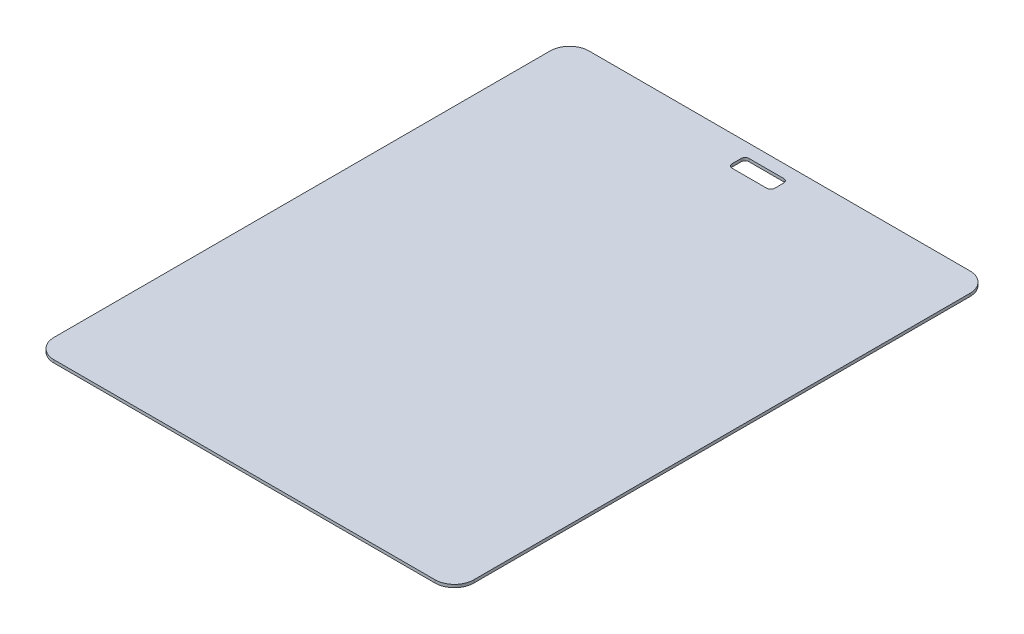
ISO-10303-21;
HEADER;
FILE_DESCRIPTION(('STEP AP214'),'2;1');
FILE_NAME('part.step','',(''),(''),'','','');
FILE_SCHEMA(('AUTOMOTIVE_DESIGN { 1 0 10303 214 1 1 1 1 }'));
ENDSEC;
DATA;
#1=APPLICATION_CONTEXT('core data for automotive mechanical design processes');
#2=APPLICATION_PROTOCOL_DEFINITION('international standard','automotive_design',2000,#1);
#3=PRODUCT_CONTEXT('',#1,'mechanical');
#4=PRODUCT('Part','Part','',(#3));
#5=PRODUCT_RELATED_PRODUCT_CATEGORY('part','',(#4));
#6=PRODUCT_DEFINITION_FORMATION('','',#4);
#7=PRODUCT_DEFINITION_CONTEXT('part definition',#1,'design');
#8=PRODUCT_DEFINITION('design','',#6,#7);
#9=PRODUCT_DEFINITION_SHAPE('','',#8);
#10=(LENGTH_UNIT() NAMED_UNIT(*) SI_UNIT(.MILLI.,.METRE.));
#11=(NAMED_UNIT(*) PLANE_ANGLE_UNIT() SI_UNIT($,.RADIAN.));
#12=(NAMED_UNIT(*) SI_UNIT($,.STERADIAN.) SOLID_ANGLE_UNIT());
#13=UNCERTAINTY_MEASURE_WITH_UNIT(LENGTH_MEASURE(1.E-05),#10,'distance_accuracy_value','');
#14=(GEOMETRIC_REPRESENTATION_CONTEXT(3) GLOBAL_UNCERTAINTY_ASSIGNED_CONTEXT((#13)) GLOBAL_UNIT_ASSIGNED_CONTEXT((#10,
#11,#12)) REPRESENTATION_CONTEXT('',''));
#15=CARTESIAN_POINT('',(0.,0.,0.));
#16=DIRECTION('',(0.,0.,1.));
#17=DIRECTION('',(1.,0.,0.));
#18=AXIS2_PLACEMENT_3D('',#15,#16,#17);
#19=CARTESIAN_POINT('',(-108.5,1.5,-147.5));
#20=DIRECTION('',(1.,0.,0.));
#21=DIRECTION('',(0.,0.,-1.));
#22=AXIS2_PLACEMENT_3D('',#19,#20,#21);
#23=PLANE('',#22);
#24=DIRECTION('',(0.,0.,1.));
#25=VECTOR('',#24,1.);
#26=CARTESIAN_POINT('',(-108.5,1.5,-147.5));
#27=LINE('',#26,#25);
#28=CARTESIAN_POINT('',(-108.5,1.5,-137.5));
#29=VERTEX_POINT('',#28);
#30=CARTESIAN_POINT('',(-108.5,1.5,119.));
#31=VERTEX_POINT('',#30);
#32=EDGE_CURVE('E174',#29,#31,#27,.T.);
#33=ORIENTED_EDGE('',*,*,#32,.F.);
#34=DIRECTION('',(0.,-1.,0.));
#35=VECTOR('',#34,1.);
#36=CARTESIAN_POINT('',(-108.5,1.5,-137.5));
#37=LINE('',#36,#35);
#38=CARTESIAN_POINT('',(-108.5,0.,-137.5));
#39=VERTEX_POINT('',#38);
#40=EDGE_CURVE('E202',#29,#39,#37,.T.);
#41=ORIENTED_EDGE('',*,*,#40,.T.);
#42=DIRECTION('',(0.,0.,1.));
#43=VECTOR('',#42,1.);
#44=CARTESIAN_POINT('',(-108.5,0.,-147.5));
#45=LINE('',#44,#43);
#46=CARTESIAN_POINT('',(-108.5,0.,119.));
#47=VERTEX_POINT('',#46);
#48=EDGE_CURVE('E270',#39,#47,#45,.T.);
#49=ORIENTED_EDGE('',*,*,#48,.T.);
#50=DIRECTION('',(0.,-1.,0.));
#51=VECTOR('',#50,1.);
#52=CARTESIAN_POINT('',(-108.5,1.5,119.));
#53=LINE('',#52,#51);
#54=EDGE_CURVE('E200',#47,#31,#53,.F.);
#55=ORIENTED_EDGE('',*,*,#54,.T.);
#56=EDGE_LOOP('',(#33,#41,#49,#55));
#57=FACE_BOUND('',#56,.T.);
#58=ADVANCED_FACE('F34',(#57),#23,.F.);
#59=CARTESIAN_POINT('',(-108.5,1.5,129.));
#60=DIRECTION('',(0.,0.,-1.));
#61=DIRECTION('',(-1.,0.,0.));
#62=AXIS2_PLACEMENT_3D('',#59,#60,#61);
#63=PLANE('',#62);
#64=DIRECTION('',(1.,0.,0.));
#65=VECTOR('',#64,1.);
#66=CARTESIAN_POINT('',(-108.5,0.,129.));
#67=LINE('',#66,#65);
#68=CARTESIAN_POINT('',(-98.5,0.,129.));
#69=VERTEX_POINT('',#68);
#70=CARTESIAN_POINT('',(98.5,0.,129.));
#71=VERTEX_POINT('',#70);
#72=EDGE_CURVE('E180',#69,#71,#67,.T.);
#73=ORIENTED_EDGE('',*,*,#72,.T.);
#74=DIRECTION('',(0.,-1.,0.));
#75=VECTOR('',#74,1.);
#76=CARTESIAN_POINT('',(98.5,1.5,129.));
#77=LINE('',#76,#75);
#78=CARTESIAN_POINT('',(98.5,1.5,129.));
#79=VERTEX_POINT('',#78);
#80=EDGE_CURVE('E208',#71,#79,#77,.F.);
#81=ORIENTED_EDGE('',*,*,#80,.T.);
#82=DIRECTION('',(1.,0.,0.));
#83=VECTOR('',#82,1.);
#84=CARTESIAN_POINT('',(-108.5,1.5,129.));
#85=LINE('',#84,#83);
#86=CARTESIAN_POINT('',(-98.5,1.5,129.));
#87=VERTEX_POINT('',#86);
#88=EDGE_CURVE('E178',#87,#79,#85,.T.);
#89=ORIENTED_EDGE('',*,*,#88,.F.);
#90=DIRECTION('',(0.,-1.,0.));
#91=VECTOR('',#90,1.);
#92=CARTESIAN_POINT('',(-98.5,1.5,129.));
#93=LINE('',#92,#91);
#94=EDGE_CURVE('E205',#87,#69,#93,.T.);
#95=ORIENTED_EDGE('',*,*,#94,.T.);
#96=EDGE_LOOP('',(#73,#81,#89,#95));
#97=FACE_BOUND('',#96,.T.);
#98=ADVANCED_FACE('F288',(#97),#63,.F.);
#99=CARTESIAN_POINT('',(108.5,1.5,-147.5));
#100=DIRECTION('',(-1.,0.,0.));
#101=DIRECTION('',(0.,0.,1.));
#102=AXIS2_PLACEMENT_3D('',#99,#100,#101);
#103=PLANE('',#102);
#104=DIRECTION('',(0.,0.,-1.));
#105=VECTOR('',#104,1.);
#106=CARTESIAN_POINT('',(108.5,0.,-147.5));
#107=LINE('',#106,#105);
#108=CARTESIAN_POINT('',(108.5,0.,119.));
#109=VERTEX_POINT('',#108);
#110=CARTESIAN_POINT('',(108.5,0.,-137.5));
#111=VERTEX_POINT('',#110);
#112=EDGE_CURVE('E175',#109,#111,#107,.T.);
#113=ORIENTED_EDGE('',*,*,#112,.T.);
#114=DIRECTION('',(0.,-1.,0.));
#115=VECTOR('',#114,1.);
#116=CARTESIAN_POINT('',(108.5,1.5,-137.5));
#117=LINE('',#116,#115);
#118=CARTESIAN_POINT('',(108.5,1.5,-137.5));
#119=VERTEX_POINT('',#118);
#120=EDGE_CURVE('E153',#111,#119,#117,.F.);
#121=ORIENTED_EDGE('',*,*,#120,.T.);
#122=DIRECTION('',(0.,0.,-1.));
#123=VECTOR('',#122,1.);
#124=CARTESIAN_POINT('',(108.5,1.5,-147.5));
#125=LINE('',#124,#123);
#126=CARTESIAN_POINT('',(108.5,1.5,119.));
#127=VERTEX_POINT('',#126);
#128=EDGE_CURVE('E279',#127,#119,#125,.T.);
#129=ORIENTED_EDGE('',*,*,#128,.F.);
#130=DIRECTION('',(0.,-1.,0.));
#131=VECTOR('',#130,1.);
#132=CARTESIAN_POINT('',(108.5,1.5,119.));
#133=LINE('',#132,#131);
#134=EDGE_CURVE('E158',#127,#109,#133,.T.);
#135=ORIENTED_EDGE('',*,*,#134,.T.);
#136=EDGE_LOOP('',(#113,#121,#129,#135));
#137=FACE_BOUND('',#136,.T.);
#138=ADVANCED_FACE('F297',(#137),#103,.F.);
#139=CARTESIAN_POINT('',(-108.5,1.5,-147.5));
#140=DIRECTION('',(0.,0.,1.));
#141=DIRECTION('',(1.,0.,0.));
#142=AXIS2_PLACEMENT_3D('',#139,#140,#141);
#143=PLANE('',#142);
#144=DIRECTION('',(-1.,0.,0.));
#145=VECTOR('',#144,1.);
#146=CARTESIAN_POINT('',(-108.5,1.5,-147.5));
#147=LINE('',#146,#145);
#148=CARTESIAN_POINT('',(98.5,1.5,-147.5));
#149=VERTEX_POINT('',#148);
#150=CARTESIAN_POINT('',(-98.5,1.5,-147.5));
#151=VERTEX_POINT('',#150);
#152=EDGE_CURVE('E168',#149,#151,#147,.T.);
#153=ORIENTED_EDGE('',*,*,#152,.F.);
#154=DIRECTION('',(0.,-1.,0.));
#155=VECTOR('',#154,1.);
#156=CARTESIAN_POINT('',(98.5,1.5,-147.5));
#157=LINE('',#156,#155);
#158=CARTESIAN_POINT('',(98.5,0.,-147.5));
#159=VERTEX_POINT('',#158);
#160=EDGE_CURVE('E152',#149,#159,#157,.T.);
#161=ORIENTED_EDGE('',*,*,#160,.T.);
#162=DIRECTION('',(-1.,0.,0.));
#163=VECTOR('',#162,1.);
#164=CARTESIAN_POINT('',(-108.5,0.,-147.5));
#165=LINE('',#164,#163);
#166=CARTESIAN_POINT('',(-98.5,0.,-147.5));
#167=VERTEX_POINT('',#166);
#168=EDGE_CURVE('E165',#159,#167,#165,.T.);
#169=ORIENTED_EDGE('',*,*,#168,.T.);
#170=DIRECTION('',(0.,-1.,0.));
#171=VECTOR('',#170,1.);
#172=CARTESIAN_POINT('',(-98.5,1.5,-147.5));
#173=LINE('',#172,#171);
#174=EDGE_CURVE('E170',#167,#151,#173,.F.);
#175=ORIENTED_EDGE('',*,*,#174,.T.);
#176=EDGE_LOOP('',(#153,#161,#169,#175));
#177=FACE_BOUND('',#176,.T.);
#178=ADVANCED_FACE('F164',(#177),#143,.F.);
#179=CARTESIAN_POINT('',(0.,1.5,0.));
#180=DIRECTION('',(0.,1.,0.));
#181=DIRECTION('',(0.,0.,1.));
#182=AXIS2_PLACEMENT_3D('',#179,#180,#181);
#183=PLANE('',#182);
#184=DIRECTION('',(0.,0.,1.));
#185=VECTOR('',#184,1.);
#186=CARTESIAN_POINT('',(-11.,1.5,-140.73));
#187=LINE('',#186,#185);
#188=CARTESIAN_POINT('',(-11.,1.5,-138.73));
#189=VERTEX_POINT('',#188);
#190=CARTESIAN_POINT('',(-11.,1.5,-133.98));
#191=VERTEX_POINT('',#190);
#192=EDGE_CURVE('E246',#189,#191,#187,.T.);
#193=ORIENTED_EDGE('',*,*,#192,.F.);
#194=CARTESIAN_POINT('',(-9.,1.5,-138.73));
#195=DIRECTION('',(0.,1.,0.));
#196=DIRECTION('',(0.,0.,1.));
#197=AXIS2_PLACEMENT_3D('',#194,#195,#196);
#198=CIRCLE('',#197,2.);
#199=CARTESIAN_POINT('',(-9.,1.5,-140.73));
#200=VERTEX_POINT('',#199);
#201=EDGE_CURVE('E42',#189,#200,#198,.F.);
#202=ORIENTED_EDGE('',*,*,#201,.T.);
#203=DIRECTION('',(-1.,0.,0.));
#204=VECTOR('',#203,1.);
#205=CARTESIAN_POINT('',(-11.,1.5,-140.73));
#206=LINE('',#205,#204);
#207=CARTESIAN_POINT('',(9.,1.5,-140.73));
#208=VERTEX_POINT('',#207);
#209=EDGE_CURVE('E244',#208,#200,#206,.T.);
#210=ORIENTED_EDGE('',*,*,#209,.F.);
#211=CARTESIAN_POINT('',(9.,1.5,-138.73));
#212=DIRECTION('',(0.,1.,0.));
#213=DIRECTION('',(0.,0.,1.));
#214=AXIS2_PLACEMENT_3D('',#211,#212,#213);
#215=CIRCLE('',#214,2.);
#216=CARTESIAN_POINT('',(11.,1.5,-138.73));
#217=VERTEX_POINT('',#216);
#218=EDGE_CURVE('E237',#208,#217,#215,.F.);
#219=ORIENTED_EDGE('',*,*,#218,.T.);
#220=DIRECTION('',(0.,0.,-1.));
#221=VECTOR('',#220,1.);
#222=CARTESIAN_POINT('',(11.,1.5,-140.73));
#223=LINE('',#222,#221);
#224=CARTESIAN_POINT('',(11.,1.5,-133.98));
#225=VERTEX_POINT('',#224);
#226=EDGE_CURVE('E252',#225,#217,#223,.T.);
#227=ORIENTED_EDGE('',*,*,#226,.F.);
#228=CARTESIAN_POINT('',(9.,1.5,-133.98));
#229=DIRECTION('',(0.,1.,0.));
#230=DIRECTION('',(0.,0.,1.));
#231=AXIS2_PLACEMENT_3D('',#228,#229,#230);
#232=CIRCLE('',#231,2.);
#233=CARTESIAN_POINT('',(9.,1.5,-131.98));
#234=VERTEX_POINT('',#233);
#235=EDGE_CURVE('E233',#225,#234,#232,.F.);
#236=ORIENTED_EDGE('',*,*,#235,.T.);
#237=DIRECTION('',(1.,0.,0.));
#238=VECTOR('',#237,1.);
#239=CARTESIAN_POINT('',(-11.,1.5,-131.98));
#240=LINE('',#239,#238);
#241=CARTESIAN_POINT('',(-9.,1.5,-131.98));
#242=VERTEX_POINT('',#241);
#243=EDGE_CURVE('E272',#242,#234,#240,.T.);
#244=ORIENTED_EDGE('',*,*,#243,.F.);
#245=CARTESIAN_POINT('',(-9.,1.5,-133.98));
#246=DIRECTION('',(0.,1.,0.));
#247=DIRECTION('',(0.,0.,1.));
#248=AXIS2_PLACEMENT_3D('',#245,#246,#247);
#249=CIRCLE('',#248,2.);
#250=EDGE_CURVE('E229',#242,#191,#249,.F.);
#251=ORIENTED_EDGE('',*,*,#250,.T.);
#252=EDGE_LOOP('',(#193,#202,#210,#219,#227,#236,#244,#251));
#253=FACE_BOUND('',#252,.T.);
#254=ORIENTED_EDGE('',*,*,#128,.T.);
#255=CARTESIAN_POINT('',(98.5,1.5,-137.5));
#256=DIRECTION('',(0.,1.,0.));
#257=DIRECTION('',(0.,0.,1.));
#258=AXIS2_PLACEMENT_3D('',#255,#256,#257);
#259=CIRCLE('',#258,10.);
#260=EDGE_CURVE('E198',#119,#149,#259,.T.);
#261=ORIENTED_EDGE('',*,*,#260,.T.);
#262=ORIENTED_EDGE('',*,*,#152,.T.);
#263=CARTESIAN_POINT('',(-98.5,1.5,-137.5));
#264=DIRECTION('',(0.,1.,0.));
#265=DIRECTION('',(0.,0.,1.));
#266=AXIS2_PLACEMENT_3D('',#263,#264,#265);
#267=CIRCLE('',#266,10.);
#268=EDGE_CURVE('E196',#151,#29,#267,.T.);
#269=ORIENTED_EDGE('',*,*,#268,.T.);
#270=ORIENTED_EDGE('',*,*,#32,.T.);
#271=CARTESIAN_POINT('',(-98.5,1.5,119.));
#272=DIRECTION('',(0.,1.,0.));
#273=DIRECTION('',(0.,0.,1.));
#274=AXIS2_PLACEMENT_3D('',#271,#272,#273);
#275=CIRCLE('',#274,10.);
#276=EDGE_CURVE('E192',#31,#87,#275,.T.);
#277=ORIENTED_EDGE('',*,*,#276,.T.);
#278=ORIENTED_EDGE('',*,*,#88,.T.);
#279=CARTESIAN_POINT('',(98.5,1.5,119.));
#280=DIRECTION('',(0.,1.,0.));
#281=DIRECTION('',(0.,0.,1.));
#282=AXIS2_PLACEMENT_3D('',#279,#280,#281);
#283=CIRCLE('',#282,10.);
#284=EDGE_CURVE('E194',#79,#127,#283,.T.);
#285=ORIENTED_EDGE('',*,*,#284,.T.);
#286=EDGE_LOOP('',(#254,#261,#262,#269,#270,#277,#278,#285));
#287=FACE_BOUND('',#286,.T.);
#288=ADVANCED_FACE('F242',(#253,#287),#183,.T.);
#289=CARTESIAN_POINT('',(0.,0.,0.));
#290=DIRECTION('',(0.,1.,0.));
#291=DIRECTION('',(0.,0.,1.));
#292=AXIS2_PLACEMENT_3D('',#289,#290,#291);
#293=PLANE('',#292);
#294=DIRECTION('',(0.,0.,-1.));
#295=VECTOR('',#294,1.);
#296=CARTESIAN_POINT('',(11.,0.,-140.73));
#297=LINE('',#296,#295);
#298=CARTESIAN_POINT('',(11.,0.,-133.98));
#299=VERTEX_POINT('',#298);
#300=CARTESIAN_POINT('',(11.,0.,-138.73));
#301=VERTEX_POINT('',#300);
#302=EDGE_CURVE('E265',#299,#301,#297,.T.);
#303=ORIENTED_EDGE('',*,*,#302,.T.);
#304=CARTESIAN_POINT('',(9.,0.,-138.73));
#305=DIRECTION('',(0.,1.,0.));
#306=DIRECTION('',(0.,0.,1.));
#307=AXIS2_PLACEMENT_3D('',#304,#305,#306);
#308=CIRCLE('',#307,2.);
#309=CARTESIAN_POINT('',(9.,0.,-140.73));
#310=VERTEX_POINT('',#309);
#311=EDGE_CURVE('E56',#301,#310,#308,.T.);
#312=ORIENTED_EDGE('',*,*,#311,.T.);
#313=DIRECTION('',(-1.,0.,0.));
#314=VECTOR('',#313,1.);
#315=CARTESIAN_POINT('',(-11.,0.,-140.73));
#316=LINE('',#315,#314);
#317=CARTESIAN_POINT('',(-9.,0.,-140.73));
#318=VERTEX_POINT('',#317);
#319=EDGE_CURVE('E258',#310,#318,#316,.T.);
#320=ORIENTED_EDGE('',*,*,#319,.T.);
#321=CARTESIAN_POINT('',(-9.,0.,-138.73));
#322=DIRECTION('',(0.,1.,0.));
#323=DIRECTION('',(0.,0.,1.));
#324=AXIS2_PLACEMENT_3D('',#321,#322,#323);
#325=CIRCLE('',#324,2.);
#326=CARTESIAN_POINT('',(-11.,0.,-138.73));
#327=VERTEX_POINT('',#326);
#328=EDGE_CURVE('E11',#318,#327,#325,.T.);
#329=ORIENTED_EDGE('',*,*,#328,.T.);
#330=DIRECTION('',(0.,0.,1.));
#331=VECTOR('',#330,1.);
#332=CARTESIAN_POINT('',(-11.,0.,-140.73));
#333=LINE('',#332,#331);
#334=CARTESIAN_POINT('',(-11.,0.,-133.98));
#335=VERTEX_POINT('',#334);
#336=EDGE_CURVE('E251',#327,#335,#333,.T.);
#337=ORIENTED_EDGE('',*,*,#336,.T.);
#338=CARTESIAN_POINT('',(-9.,0.,-133.98));
#339=DIRECTION('',(0.,1.,0.));
#340=DIRECTION('',(0.,0.,1.));
#341=AXIS2_PLACEMENT_3D('',#338,#339,#340);
#342=CIRCLE('',#341,2.);
#343=CARTESIAN_POINT('',(-9.,0.,-131.98));
#344=VERTEX_POINT('',#343);
#345=EDGE_CURVE('E231',#335,#344,#342,.T.);
#346=ORIENTED_EDGE('',*,*,#345,.T.);
#347=DIRECTION('',(1.,0.,0.));
#348=VECTOR('',#347,1.);
#349=CARTESIAN_POINT('',(-11.,0.,-131.98));
#350=LINE('',#349,#348);
#351=CARTESIAN_POINT('',(9.,0.,-131.98));
#352=VERTEX_POINT('',#351);
#353=EDGE_CURVE('E262',#344,#352,#350,.T.);
#354=ORIENTED_EDGE('',*,*,#353,.T.);
#355=CARTESIAN_POINT('',(9.,0.,-133.98));
#356=DIRECTION('',(0.,1.,0.));
#357=DIRECTION('',(0.,0.,1.));
#358=AXIS2_PLACEMENT_3D('',#355,#356,#357);
#359=CIRCLE('',#358,2.);
#360=EDGE_CURVE('E235',#352,#299,#359,.T.);
#361=ORIENTED_EDGE('',*,*,#360,.T.);
#362=EDGE_LOOP('',(#303,#312,#320,#329,#337,#346,#354,#361));
#363=FACE_BOUND('',#362,.T.);
#364=ORIENTED_EDGE('',*,*,#168,.F.);
#365=CARTESIAN_POINT('',(98.5,0.,-137.5));
#366=DIRECTION('',(0.,1.,0.));
#367=DIRECTION('',(0.,0.,1.));
#368=AXIS2_PLACEMENT_3D('',#365,#366,#367);
#369=CIRCLE('',#368,10.);
#370=EDGE_CURVE('E148',#159,#111,#369,.F.);
#371=ORIENTED_EDGE('',*,*,#370,.T.);
#372=ORIENTED_EDGE('',*,*,#112,.F.);
#373=CARTESIAN_POINT('',(98.5,0.,119.));
#374=DIRECTION('',(0.,1.,0.));
#375=DIRECTION('',(0.,0.,1.));
#376=AXIS2_PLACEMENT_3D('',#373,#374,#375);
#377=CIRCLE('',#376,10.);
#378=EDGE_CURVE('E186',#109,#71,#377,.F.);
#379=ORIENTED_EDGE('',*,*,#378,.T.);
#380=ORIENTED_EDGE('',*,*,#72,.F.);
#381=CARTESIAN_POINT('',(-98.5,0.,119.));
#382=DIRECTION('',(0.,1.,0.));
#383=DIRECTION('',(0.,0.,1.));
#384=AXIS2_PLACEMENT_3D('',#381,#382,#383);
#385=CIRCLE('',#384,10.);
#386=EDGE_CURVE('E169',#69,#47,#385,.F.);
#387=ORIENTED_EDGE('',*,*,#386,.T.);
#388=ORIENTED_EDGE('',*,*,#48,.F.);
#389=CARTESIAN_POINT('',(-98.5,0.,-137.5));
#390=DIRECTION('',(0.,1.,0.));
#391=DIRECTION('',(0.,0.,1.));
#392=AXIS2_PLACEMENT_3D('',#389,#390,#391);
#393=CIRCLE('',#392,10.);
#394=EDGE_CURVE('E159',#39,#167,#393,.F.);
#395=ORIENTED_EDGE('',*,*,#394,.T.);
#396=EDGE_LOOP('',(#364,#371,#372,#379,#380,#387,#388,#395));
#397=FACE_BOUND('',#396,.T.);
#398=ADVANCED_FACE('F172',(#363,#397),#293,.F.);
#399=CARTESIAN_POINT('',(98.5,1.5,-137.5));
#400=DIRECTION('',(0.,-1.,0.));
#401=DIRECTION('',(0.,0.,-1.));
#402=AXIS2_PLACEMENT_3D('',#399,#400,#401);
#403=CYLINDRICAL_SURFACE('',#402,10.);
#404=ORIENTED_EDGE('',*,*,#260,.F.);
#405=ORIENTED_EDGE('',*,*,#120,.F.);
#406=ORIENTED_EDGE('',*,*,#370,.F.);
#407=ORIENTED_EDGE('',*,*,#160,.F.);
#408=EDGE_LOOP('',(#404,#405,#406,#407));
#409=FACE_BOUND('',#408,.T.);
#410=ADVANCED_FACE('F151',(#409),#403,.T.);
#411=CARTESIAN_POINT('',(-98.5,1.5,-137.5));
#412=DIRECTION('',(0.,-1.,0.));
#413=DIRECTION('',(0.,0.,-1.));
#414=AXIS2_PLACEMENT_3D('',#411,#412,#413);
#415=CYLINDRICAL_SURFACE('',#414,10.);
#416=ORIENTED_EDGE('',*,*,#268,.F.);
#417=ORIENTED_EDGE('',*,*,#174,.F.);
#418=ORIENTED_EDGE('',*,*,#394,.F.);
#419=ORIENTED_EDGE('',*,*,#40,.F.);
#420=EDGE_LOOP('',(#416,#417,#418,#419));
#421=FACE_BOUND('',#420,.T.);
#422=ADVANCED_FACE('F315',(#421),#415,.T.);
#423=CARTESIAN_POINT('',(98.5,1.5,119.));
#424=DIRECTION('',(0.,-1.,0.));
#425=DIRECTION('',(0.,0.,-1.));
#426=AXIS2_PLACEMENT_3D('',#423,#424,#425);
#427=CYLINDRICAL_SURFACE('',#426,10.);
#428=ORIENTED_EDGE('',*,*,#284,.F.);
#429=ORIENTED_EDGE('',*,*,#80,.F.);
#430=ORIENTED_EDGE('',*,*,#378,.F.);
#431=ORIENTED_EDGE('',*,*,#134,.F.);
#432=EDGE_LOOP('',(#428,#429,#430,#431));
#433=FACE_BOUND('',#432,.T.);
#434=ADVANCED_FACE('F293',(#433),#427,.T.);
#435=CARTESIAN_POINT('',(-98.5,1.5,119.));
#436=DIRECTION('',(0.,-1.,0.));
#437=DIRECTION('',(0.,0.,-1.));
#438=AXIS2_PLACEMENT_3D('',#435,#436,#437);
#439=CYLINDRICAL_SURFACE('',#438,10.);
#440=ORIENTED_EDGE('',*,*,#276,.F.);
#441=ORIENTED_EDGE('',*,*,#54,.F.);
#442=ORIENTED_EDGE('',*,*,#386,.F.);
#443=ORIENTED_EDGE('',*,*,#94,.F.);
#444=EDGE_LOOP('',(#440,#441,#442,#443));
#445=FACE_BOUND('',#444,.T.);
#446=ADVANCED_FACE('F321',(#445),#439,.T.);
#447=CARTESIAN_POINT('',(-11.,0.,-140.73));
#448=DIRECTION('',(-1.,0.,0.));
#449=DIRECTION('',(0.,0.,1.));
#450=AXIS2_PLACEMENT_3D('',#447,#448,#449);
#451=PLANE('',#450);
#452=ORIENTED_EDGE('',*,*,#192,.T.);
#453=DIRECTION('',(0.,1.,0.));
#454=VECTOR('',#453,1.);
#455=CARTESIAN_POINT('',(-11.,0.,-133.98));
#456=LINE('',#455,#454);
#457=EDGE_CURVE('E218',#191,#335,#456,.F.);
#458=ORIENTED_EDGE('',*,*,#457,.T.);
#459=ORIENTED_EDGE('',*,*,#336,.F.);
#460=DIRECTION('',(0.,1.,0.));
#461=VECTOR('',#460,1.);
#462=CARTESIAN_POINT('',(-11.,1.5,-138.73));
#463=LINE('',#462,#461);
#464=EDGE_CURVE('E215',#327,#189,#463,.T.);
#465=ORIENTED_EDGE('',*,*,#464,.T.);
#466=EDGE_LOOP('',(#452,#458,#459,#465));
#467=FACE_BOUND('',#466,.T.);
#468=ADVANCED_FACE('F260',(#467),#451,.F.);
#469=CARTESIAN_POINT('',(-11.,0.,-140.73));
#470=DIRECTION('',(0.,0.,-1.));
#471=DIRECTION('',(-1.,0.,0.));
#472=AXIS2_PLACEMENT_3D('',#469,#470,#471);
#473=PLANE('',#472);
#474=ORIENTED_EDGE('',*,*,#319,.F.);
#475=DIRECTION('',(0.,1.,0.));
#476=VECTOR('',#475,1.);
#477=CARTESIAN_POINT('',(9.,1.5,-140.73));
#478=LINE('',#477,#476);
#479=EDGE_CURVE('E226',#310,#208,#478,.T.);
#480=ORIENTED_EDGE('',*,*,#479,.T.);
#481=ORIENTED_EDGE('',*,*,#209,.T.);
#482=DIRECTION('',(0.,1.,0.));
#483=VECTOR('',#482,1.);
#484=CARTESIAN_POINT('',(-9.,0.,-140.73));
#485=LINE('',#484,#483);
#486=EDGE_CURVE('E49',#200,#318,#485,.F.);
#487=ORIENTED_EDGE('',*,*,#486,.T.);
#488=EDGE_LOOP('',(#474,#480,#481,#487));
#489=FACE_BOUND('',#488,.T.);
#490=ADVANCED_FACE('F249',(#489),#473,.F.);
#491=CARTESIAN_POINT('',(11.,0.,-140.73));
#492=DIRECTION('',(1.,0.,0.));
#493=DIRECTION('',(0.,0.,-1.));
#494=AXIS2_PLACEMENT_3D('',#491,#492,#493);
#495=PLANE('',#494);
#496=ORIENTED_EDGE('',*,*,#302,.F.);
#497=DIRECTION('',(0.,1.,0.));
#498=VECTOR('',#497,1.);
#499=CARTESIAN_POINT('',(11.,1.5,-133.98));
#500=LINE('',#499,#498);
#501=EDGE_CURVE('E222',#299,#225,#500,.T.);
#502=ORIENTED_EDGE('',*,*,#501,.T.);
#503=ORIENTED_EDGE('',*,*,#226,.T.);
#504=DIRECTION('',(0.,1.,0.));
#505=VECTOR('',#504,1.);
#506=CARTESIAN_POINT('',(11.,0.,-138.73));
#507=LINE('',#506,#505);
#508=EDGE_CURVE('E220',#217,#301,#507,.F.);
#509=ORIENTED_EDGE('',*,*,#508,.T.);
#510=EDGE_LOOP('',(#496,#502,#503,#509));
#511=FACE_BOUND('',#510,.T.);
#512=ADVANCED_FACE('F343',(#511),#495,.F.);
#513=CARTESIAN_POINT('',(-11.,0.,-131.98));
#514=DIRECTION('',(0.,0.,1.));
#515=DIRECTION('',(1.,0.,0.));
#516=AXIS2_PLACEMENT_3D('',#513,#514,#515);
#517=PLANE('',#516);
#518=ORIENTED_EDGE('',*,*,#353,.F.);
#519=DIRECTION('',(0.,1.,0.));
#520=VECTOR('',#519,1.);
#521=CARTESIAN_POINT('',(-9.,1.5,-131.98));
#522=LINE('',#521,#520);
#523=EDGE_CURVE('E212',#344,#242,#522,.T.);
#524=ORIENTED_EDGE('',*,*,#523,.T.);
#525=ORIENTED_EDGE('',*,*,#243,.T.);
#526=DIRECTION('',(0.,1.,0.));
#527=VECTOR('',#526,1.);
#528=CARTESIAN_POINT('',(9.,0.,-131.98));
#529=LINE('',#528,#527);
#530=EDGE_CURVE('E210',#234,#352,#529,.F.);
#531=ORIENTED_EDGE('',*,*,#530,.T.);
#532=EDGE_LOOP('',(#518,#524,#525,#531));
#533=FACE_BOUND('',#532,.T.);
#534=ADVANCED_FACE('F329',(#533),#517,.F.);
#535=CARTESIAN_POINT('',(-9.,0.,-133.98));
#536=DIRECTION('',(0.,-1.,0.));
#537=DIRECTION('',(0.,0.,-1.));
#538=AXIS2_PLACEMENT_3D('',#535,#536,#537);
#539=CYLINDRICAL_SURFACE('',#538,2.);
#540=ORIENTED_EDGE('',*,*,#345,.F.);
#541=ORIENTED_EDGE('',*,*,#457,.F.);
#542=ORIENTED_EDGE('',*,*,#250,.F.);
#543=ORIENTED_EDGE('',*,*,#523,.F.);
#544=EDGE_LOOP('',(#540,#541,#542,#543));
#545=FACE_BOUND('',#544,.T.);
#546=ADVANCED_FACE('F325',(#545),#539,.F.);
#547=CARTESIAN_POINT('',(9.,0.,-133.98));
#548=DIRECTION('',(0.,-1.,0.));
#549=DIRECTION('',(0.,0.,-1.));
#550=AXIS2_PLACEMENT_3D('',#547,#548,#549);
#551=CYLINDRICAL_SURFACE('',#550,2.);
#552=ORIENTED_EDGE('',*,*,#360,.F.);
#553=ORIENTED_EDGE('',*,*,#530,.F.);
#554=ORIENTED_EDGE('',*,*,#235,.F.);
#555=ORIENTED_EDGE('',*,*,#501,.F.);
#556=EDGE_LOOP('',(#552,#553,#554,#555));
#557=FACE_BOUND('',#556,.T.);
#558=ADVANCED_FACE('F328',(#557),#551,.F.);
#559=CARTESIAN_POINT('',(9.,0.,-138.73));
#560=DIRECTION('',(0.,-1.,0.));
#561=DIRECTION('',(0.,0.,-1.));
#562=AXIS2_PLACEMENT_3D('',#559,#560,#561);
#563=CYLINDRICAL_SURFACE('',#562,2.);
#564=ORIENTED_EDGE('',*,*,#311,.F.);
#565=ORIENTED_EDGE('',*,*,#508,.F.);
#566=ORIENTED_EDGE('',*,*,#218,.F.);
#567=ORIENTED_EDGE('',*,*,#479,.F.);
#568=EDGE_LOOP('',(#564,#565,#566,#567));
#569=FACE_BOUND('',#568,.T.);
#570=ADVANCED_FACE('F332',(#569),#563,.F.);
#571=CARTESIAN_POINT('',(-9.,0.,-138.73));
#572=DIRECTION('',(0.,-1.,0.));
#573=DIRECTION('',(0.,0.,-1.));
#574=AXIS2_PLACEMENT_3D('',#571,#572,#573);
#575=CYLINDRICAL_SURFACE('',#574,2.);
#576=ORIENTED_EDGE('',*,*,#328,.F.);
#577=ORIENTED_EDGE('',*,*,#486,.F.);
#578=ORIENTED_EDGE('',*,*,#201,.F.);
#579=ORIENTED_EDGE('',*,*,#464,.F.);
#580=EDGE_LOOP('',(#576,#577,#578,#579));
#581=FACE_BOUND('',#580,.T.);
#582=ADVANCED_FACE('F36',(#581),#575,.F.);
#583=CLOSED_SHELL('',(#58,#98,#138,#178,#288,#398,#410,#422,#434,#446,#468,#490,#512,#534,#546,
#558,#570,#582));
#584=MANIFOLD_SOLID_BREP('B2',#583);
#585=ADVANCED_BREP_SHAPE_REPRESENTATION('',(#18,#584),#14);
#586=SHAPE_DEFINITION_REPRESENTATION(#9,#585);
ENDSEC;
END-ISO-10303-21;
